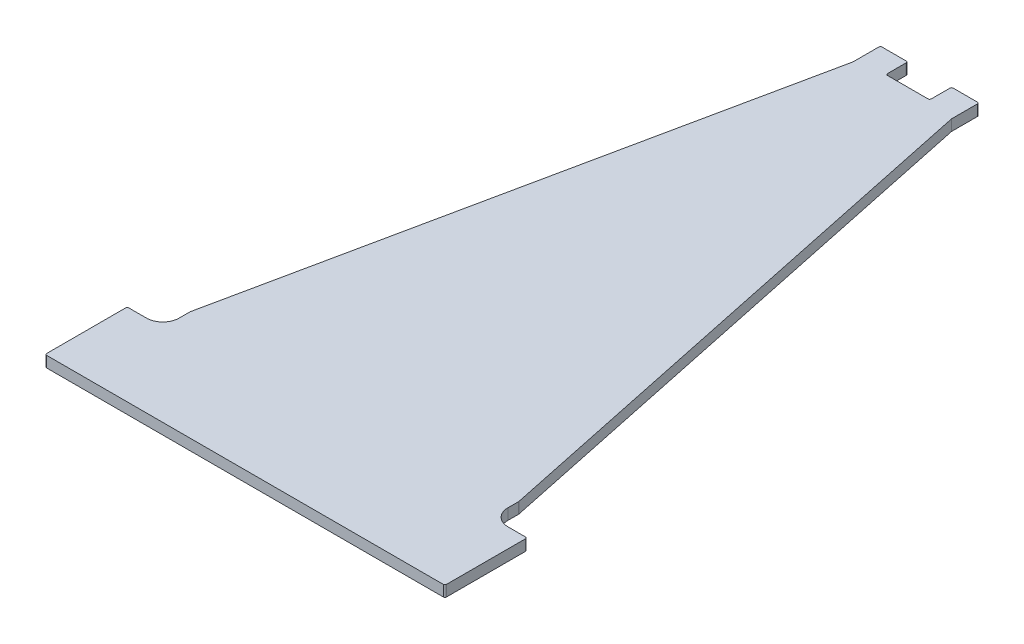
ISO-10303-21;
HEADER;
FILE_DESCRIPTION(('STEP AP214'),'2;1');
FILE_NAME('part.step','',(''),(''),'','','');
FILE_SCHEMA(('AUTOMOTIVE_DESIGN { 1 0 10303 214 1 1 1 1 }'));
ENDSEC;
DATA;
#1=APPLICATION_CONTEXT('core data for automotive mechanical design processes');
#2=APPLICATION_PROTOCOL_DEFINITION('international standard','automotive_design',2000,#1);
#3=PRODUCT_CONTEXT('',#1,'mechanical');
#4=PRODUCT('Part','Part','',(#3));
#5=PRODUCT_RELATED_PRODUCT_CATEGORY('part','',(#4));
#6=PRODUCT_DEFINITION_FORMATION('','',#4);
#7=PRODUCT_DEFINITION_CONTEXT('part definition',#1,'design');
#8=PRODUCT_DEFINITION('design','',#6,#7);
#9=PRODUCT_DEFINITION_SHAPE('','',#8);
#10=(LENGTH_UNIT() NAMED_UNIT(*) SI_UNIT(.MILLI.,.METRE.));
#11=(NAMED_UNIT(*) PLANE_ANGLE_UNIT() SI_UNIT($,.RADIAN.));
#12=(NAMED_UNIT(*) SI_UNIT($,.STERADIAN.) SOLID_ANGLE_UNIT());
#13=UNCERTAINTY_MEASURE_WITH_UNIT(LENGTH_MEASURE(1.E-05),#10,'distance_accuracy_value','');
#14=(GEOMETRIC_REPRESENTATION_CONTEXT(3) GLOBAL_UNCERTAINTY_ASSIGNED_CONTEXT((#13)) GLOBAL_UNIT_ASSIGNED_CONTEXT((#10,
#11,#12)) REPRESENTATION_CONTEXT('',''));
#15=CARTESIAN_POINT('',(0.,0.,0.));
#16=DIRECTION('',(0.,0.,1.));
#17=DIRECTION('',(1.,0.,0.));
#18=AXIS2_PLACEMENT_3D('',#15,#16,#17);
#19=CARTESIAN_POINT('',(7.3,0.2,0.));
#20=DIRECTION('',(0.,0.,-1.));
#21=DIRECTION('',(-1.,0.,0.));
#22=AXIS2_PLACEMENT_3D('',#19,#20,#21);
#23=PLANE('',#22);
#24=DIRECTION('',(1.,0.,0.));
#25=VECTOR('',#24,1.);
#26=CARTESIAN_POINT('',(7.3,0.,0.));
#27=LINE('',#26,#25);
#28=CARTESIAN_POINT('',(0.0299999999999996,0.,0.));
#29=VERTEX_POINT('',#28);
#30=CARTESIAN_POINT('',(7.27,0.,0.));
#31=VERTEX_POINT('',#30);
#32=EDGE_CURVE('E526',#29,#31,#27,.T.);
#33=ORIENTED_EDGE('',*,*,#32,.T.);
#34=DIRECTION('',(0.,-1.,0.));
#35=VECTOR('',#34,1.);
#36=CARTESIAN_POINT('',(7.27,0.2,0.));
#37=LINE('',#36,#35);
#38=CARTESIAN_POINT('',(7.27,0.2,0.));
#39=VERTEX_POINT('',#38);
#40=EDGE_CURVE('E351',#31,#39,#37,.F.);
#41=ORIENTED_EDGE('',*,*,#40,.T.);
#42=DIRECTION('',(1.,0.,0.));
#43=VECTOR('',#42,1.);
#44=CARTESIAN_POINT('',(7.3,0.2,0.));
#45=LINE('',#44,#43);
#46=CARTESIAN_POINT('',(0.0299999999999996,0.2,0.));
#47=VERTEX_POINT('',#46);
#48=EDGE_CURVE('E287',#47,#39,#45,.T.);
#49=ORIENTED_EDGE('',*,*,#48,.F.);
#50=DIRECTION('',(0.,-1.,0.));
#51=VECTOR('',#50,1.);
#52=CARTESIAN_POINT('',(0.0299999999999996,0.2,0.));
#53=LINE('',#52,#51);
#54=EDGE_CURVE('E347',#47,#29,#53,.T.);
#55=ORIENTED_EDGE('',*,*,#54,.T.);
#56=EDGE_LOOP('',(#33,#41,#49,#55));
#57=FACE_BOUND('',#56,.T.);
#58=ADVANCED_FACE('F41',(#57),#23,.F.);
#59=CARTESIAN_POINT('',(7.3,0.2,-1.5));
#60=DIRECTION('',(-1.,0.,0.));
#61=DIRECTION('',(0.,0.,1.));
#62=AXIS2_PLACEMENT_3D('',#59,#60,#61);
#63=PLANE('',#62);
#64=DIRECTION('',(0.,0.,-1.));
#65=VECTOR('',#64,1.);
#66=CARTESIAN_POINT('',(7.3,0.2,-1.5));
#67=LINE('',#66,#65);
#68=CARTESIAN_POINT('',(7.3,0.2,-0.0300000000000001));
#69=VERTEX_POINT('',#68);
#70=CARTESIAN_POINT('',(7.3,0.2,-1.47));
#71=VERTEX_POINT('',#70);
#72=EDGE_CURVE('E587',#69,#71,#67,.T.);
#73=ORIENTED_EDGE('',*,*,#72,.F.);
#74=DIRECTION('',(0.,-1.,0.));
#75=VECTOR('',#74,1.);
#76=CARTESIAN_POINT('',(7.3,0.2,-0.0300000000000001));
#77=LINE('',#76,#75);
#78=CARTESIAN_POINT('',(7.3,0.,-0.0300000000000001));
#79=VERTEX_POINT('',#78);
#80=EDGE_CURVE('E314',#69,#79,#77,.T.);
#81=ORIENTED_EDGE('',*,*,#80,.T.);
#82=DIRECTION('',(0.,0.,-1.));
#83=VECTOR('',#82,1.);
#84=CARTESIAN_POINT('',(7.3,0.,-1.5));
#85=LINE('',#84,#83);
#86=CARTESIAN_POINT('',(7.3,0.,-1.47));
#87=VERTEX_POINT('',#86);
#88=EDGE_CURVE('E530',#79,#87,#85,.T.);
#89=ORIENTED_EDGE('',*,*,#88,.T.);
#90=DIRECTION('',(0.,-1.,0.));
#91=VECTOR('',#90,1.);
#92=CARTESIAN_POINT('',(7.3,0.2,-1.47));
#93=LINE('',#92,#91);
#94=EDGE_CURVE('E311',#87,#71,#93,.F.);
#95=ORIENTED_EDGE('',*,*,#94,.T.);
#96=EDGE_LOOP('',(#73,#81,#89,#95));
#97=FACE_BOUND('',#96,.T.);
#98=ADVANCED_FACE('F712',(#97),#63,.F.);
#99=CARTESIAN_POINT('',(6.65,0.2,-1.5));
#100=DIRECTION('',(0.,0.,1.));
#101=DIRECTION('',(1.,0.,0.));
#102=AXIS2_PLACEMENT_3D('',#99,#100,#101);
#103=PLANE('',#102);
#104=DIRECTION('',(-1.,0.,0.));
#105=VECTOR('',#104,1.);
#106=CARTESIAN_POINT('',(6.65,0.2,-1.5));
#107=LINE('',#106,#105);
#108=CARTESIAN_POINT('',(7.27,0.2,-1.5));
#109=VERTEX_POINT('',#108);
#110=CARTESIAN_POINT('',(6.95,0.2,-1.5));
#111=VERTEX_POINT('',#110);
#112=EDGE_CURVE('E591',#109,#111,#107,.T.);
#113=ORIENTED_EDGE('',*,*,#112,.F.);
#114=DIRECTION('',(0.,-1.,0.));
#115=VECTOR('',#114,1.);
#116=CARTESIAN_POINT('',(7.27,0.2,-1.5));
#117=LINE('',#116,#115);
#118=CARTESIAN_POINT('',(7.27,0.,-1.5));
#119=VERTEX_POINT('',#118);
#120=EDGE_CURVE('E389',#109,#119,#117,.T.);
#121=ORIENTED_EDGE('',*,*,#120,.T.);
#122=DIRECTION('',(-1.,0.,0.));
#123=VECTOR('',#122,1.);
#124=CARTESIAN_POINT('',(6.65,0.,-1.5));
#125=LINE('',#124,#123);
#126=CARTESIAN_POINT('',(6.95,0.,-1.5));
#127=VERTEX_POINT('',#126);
#128=EDGE_CURVE('E534',#119,#127,#125,.T.);
#129=ORIENTED_EDGE('',*,*,#128,.T.);
#130=DIRECTION('',(0.,-1.,0.));
#131=VECTOR('',#130,1.);
#132=CARTESIAN_POINT('',(6.95,0.2,-1.5));
#133=LINE('',#132,#131);
#134=EDGE_CURVE('E265',#127,#111,#133,.F.);
#135=ORIENTED_EDGE('',*,*,#134,.T.);
#136=EDGE_LOOP('',(#113,#121,#129,#135));
#137=FACE_BOUND('',#136,.T.);
#138=ADVANCED_FACE('F704',(#137),#103,.F.);
#139=CARTESIAN_POINT('',(6.65,0.2,-2.));
#140=DIRECTION('',(-1.,0.,0.));
#141=DIRECTION('',(0.,0.,1.));
#142=AXIS2_PLACEMENT_3D('',#139,#140,#141);
#143=PLANE('',#142);
#144=DIRECTION('',(0.,0.,-1.));
#145=VECTOR('',#144,1.);
#146=CARTESIAN_POINT('',(6.65,0.,-2.));
#147=LINE('',#146,#145);
#148=CARTESIAN_POINT('',(6.65,0.,-1.8));
#149=VERTEX_POINT('',#148);
#150=CARTESIAN_POINT('',(6.65,0.,-1.99688398345684));
#151=VERTEX_POINT('',#150);
#152=EDGE_CURVE('E537',#149,#151,#147,.T.);
#153=ORIENTED_EDGE('',*,*,#152,.T.);
#154=DIRECTION('',(0.,-1.,0.));
#155=VECTOR('',#154,1.);
#156=CARTESIAN_POINT('',(6.65,0.2,-1.99688398345684));
#157=LINE('',#156,#155);
#158=CARTESIAN_POINT('',(6.65,0.2,-1.99688398345684));
#159=VERTEX_POINT('',#158);
#160=EDGE_CURVE('E400',#151,#159,#157,.F.);
#161=ORIENTED_EDGE('',*,*,#160,.T.);
#162=DIRECTION('',(0.,0.,-1.));
#163=VECTOR('',#162,1.);
#164=CARTESIAN_POINT('',(6.65,0.2,-2.));
#165=LINE('',#164,#163);
#166=CARTESIAN_POINT('',(6.65,0.2,-1.8));
#167=VERTEX_POINT('',#166);
#168=EDGE_CURVE('E596',#167,#159,#165,.T.);
#169=ORIENTED_EDGE('',*,*,#168,.F.);
#170=DIRECTION('',(0.,-1.,0.));
#171=VECTOR('',#170,1.);
#172=CARTESIAN_POINT('',(6.65,0.,-1.8));
#173=LINE('',#172,#171);
#174=EDGE_CURVE('E295',#167,#149,#173,.T.);
#175=ORIENTED_EDGE('',*,*,#174,.T.);
#176=EDGE_LOOP('',(#153,#161,#169,#175));
#177=FACE_BOUND('',#176,.T.);
#178=ADVANCED_FACE('F694',(#177),#143,.F.);
#179=CARTESIAN_POINT('',(4.55,0.2,-12.));
#180=DIRECTION('',(-0.978653496601971,0.,0.205517234286414));
#181=DIRECTION('',(0.205517234286414,0.,0.978653496601971));
#182=AXIS2_PLACEMENT_3D('',#179,#180,#181);
#183=PLANE('',#182);
#184=DIRECTION('',(-0.205517234286414,0.,-0.978653496601971));
#185=VECTOR('',#184,1.);
#186=CARTESIAN_POINT('',(4.55,0.2,-12.));
#187=LINE('',#186,#185);
#188=CARTESIAN_POINT('',(6.64935960489806,0.2,-2.00304950048543));
#189=VERTEX_POINT('',#188);
#190=CARTESIAN_POINT('',(4.55064039510194,0.2,-11.9969504995146));
#191=VERTEX_POINT('',#190);
#192=EDGE_CURVE('E600',#189,#191,#187,.T.);
#193=ORIENTED_EDGE('',*,*,#192,.F.);
#194=DIRECTION('',(0.,-1.,0.));
#195=VECTOR('',#194,1.);
#196=CARTESIAN_POINT('',(6.64935960489806,0.2,-2.00304950048543));
#197=LINE('',#196,#195);
#198=CARTESIAN_POINT('',(6.64935960489806,0.,-2.00304950048543));
#199=VERTEX_POINT('',#198);
#200=EDGE_CURVE('E396',#189,#199,#197,.T.);
#201=ORIENTED_EDGE('',*,*,#200,.T.);
#202=DIRECTION('',(-0.205517234286414,0.,-0.978653496601971));
#203=VECTOR('',#202,1.);
#204=CARTESIAN_POINT('',(4.55,0.,-12.));
#205=LINE('',#204,#203);
#206=CARTESIAN_POINT('',(4.55064039510194,0.,-11.9969504995146));
#207=VERTEX_POINT('',#206);
#208=EDGE_CURVE('E541',#199,#207,#205,.T.);
#209=ORIENTED_EDGE('',*,*,#208,.T.);
#210=DIRECTION('',(0.,-1.,0.));
#211=VECTOR('',#210,1.);
#212=CARTESIAN_POINT('',(4.55064039510194,0.2,-11.9969504995146));
#213=LINE('',#212,#211);
#214=EDGE_CURVE('E393',#207,#191,#213,.F.);
#215=ORIENTED_EDGE('',*,*,#214,.T.);
#216=EDGE_LOOP('',(#193,#201,#209,#215));
#217=FACE_BOUND('',#216,.T.);
#218=ADVANCED_FACE('F686',(#217),#183,.F.);
#219=CARTESIAN_POINT('',(4.55,0.2,-12.5));
#220=DIRECTION('',(-1.,0.,0.));
#221=DIRECTION('',(0.,0.,1.));
#222=AXIS2_PLACEMENT_3D('',#219,#220,#221);
#223=PLANE('',#222);
#224=DIRECTION('',(0.,0.,-1.));
#225=VECTOR('',#224,1.);
#226=CARTESIAN_POINT('',(4.55,0.2,-12.5));
#227=LINE('',#226,#225);
#228=CARTESIAN_POINT('',(4.55,0.2,-12.0031160165432));
#229=VERTEX_POINT('',#228);
#230=CARTESIAN_POINT('',(4.55,0.2,-12.47));
#231=VERTEX_POINT('',#230);
#232=EDGE_CURVE('E604',#229,#231,#227,.T.);
#233=ORIENTED_EDGE('',*,*,#232,.F.);
#234=DIRECTION('',(0.,-1.,0.));
#235=VECTOR('',#234,1.);
#236=CARTESIAN_POINT('',(4.55,0.,-12.0031160165432));
#237=LINE('',#236,#235);
#238=CARTESIAN_POINT('',(4.55,0.,-12.0031160165432));
#239=VERTEX_POINT('',#238);
#240=EDGE_CURVE('E406',#229,#239,#237,.T.);
#241=ORIENTED_EDGE('',*,*,#240,.T.);
#242=DIRECTION('',(0.,0.,-1.));
#243=VECTOR('',#242,1.);
#244=CARTESIAN_POINT('',(4.55,0.,-12.5));
#245=LINE('',#244,#243);
#246=CARTESIAN_POINT('',(4.55,0.,-12.47));
#247=VERTEX_POINT('',#246);
#248=EDGE_CURVE('E545',#239,#247,#245,.T.);
#249=ORIENTED_EDGE('',*,*,#248,.T.);
#250=DIRECTION('',(0.,-1.,0.));
#251=VECTOR('',#250,1.);
#252=CARTESIAN_POINT('',(4.55,0.2,-12.47));
#253=LINE('',#252,#251);
#254=EDGE_CURVE('E403',#247,#231,#253,.F.);
#255=ORIENTED_EDGE('',*,*,#254,.T.);
#256=EDGE_LOOP('',(#233,#241,#249,#255));
#257=FACE_BOUND('',#256,.T.);
#258=ADVANCED_FACE('F677',(#257),#223,.F.);
#259=CARTESIAN_POINT('',(4.05,0.2,-12.5));
#260=DIRECTION('',(0.,0.,1.));
#261=DIRECTION('',(1.,0.,0.));
#262=AXIS2_PLACEMENT_3D('',#259,#260,#261);
#263=PLANE('',#262);
#264=DIRECTION('',(-1.,0.,0.));
#265=VECTOR('',#264,1.);
#266=CARTESIAN_POINT('',(4.05,0.2,-12.5));
#267=LINE('',#266,#265);
#268=CARTESIAN_POINT('',(4.52,0.2,-12.5));
#269=VERTEX_POINT('',#268);
#270=CARTESIAN_POINT('',(4.08,0.2,-12.5));
#271=VERTEX_POINT('',#270);
#272=EDGE_CURVE('E608',#269,#271,#267,.T.);
#273=ORIENTED_EDGE('',*,*,#272,.F.);
#274=DIRECTION('',(0.,-1.,0.));
#275=VECTOR('',#274,1.);
#276=CARTESIAN_POINT('',(4.52,0.2,-12.5));
#277=LINE('',#276,#275);
#278=CARTESIAN_POINT('',(4.52,0.,-12.5));
#279=VERTEX_POINT('',#278);
#280=EDGE_CURVE('E413',#269,#279,#277,.T.);
#281=ORIENTED_EDGE('',*,*,#280,.T.);
#282=DIRECTION('',(-1.,0.,0.));
#283=VECTOR('',#282,1.);
#284=CARTESIAN_POINT('',(4.05,0.,-12.5));
#285=LINE('',#284,#283);
#286=CARTESIAN_POINT('',(4.08,0.,-12.5));
#287=VERTEX_POINT('',#286);
#288=EDGE_CURVE('E549',#279,#287,#285,.T.);
#289=ORIENTED_EDGE('',*,*,#288,.T.);
#290=DIRECTION('',(0.,-1.,0.));
#291=VECTOR('',#290,1.);
#292=CARTESIAN_POINT('',(4.08,0.2,-12.5));
#293=LINE('',#292,#291);
#294=EDGE_CURVE('E410',#287,#271,#293,.F.);
#295=ORIENTED_EDGE('',*,*,#294,.T.);
#296=EDGE_LOOP('',(#273,#281,#289,#295));
#297=FACE_BOUND('',#296,.T.);
#298=ADVANCED_FACE('F668',(#297),#263,.F.);
#299=CARTESIAN_POINT('',(4.05,0.2,-12.1));
#300=DIRECTION('',(1.,0.,0.));
#301=DIRECTION('',(0.,0.,-1.));
#302=AXIS2_PLACEMENT_3D('',#299,#300,#301);
#303=PLANE('',#302);
#304=DIRECTION('',(0.,0.,1.));
#305=VECTOR('',#304,1.);
#306=CARTESIAN_POINT('',(4.05,0.2,-12.1));
#307=LINE('',#306,#305);
#308=CARTESIAN_POINT('',(4.05,0.2,-12.47));
#309=VERTEX_POINT('',#308);
#310=CARTESIAN_POINT('',(4.05,0.2,-12.13));
#311=VERTEX_POINT('',#310);
#312=EDGE_CURVE('E612',#309,#311,#307,.T.);
#313=ORIENTED_EDGE('',*,*,#312,.F.);
#314=DIRECTION('',(0.,-1.,0.));
#315=VECTOR('',#314,1.);
#316=CARTESIAN_POINT('',(4.05,0.2,-12.47));
#317=LINE('',#316,#315);
#318=CARTESIAN_POINT('',(4.05,0.,-12.47));
#319=VERTEX_POINT('',#318);
#320=EDGE_CURVE('E420',#309,#319,#317,.T.);
#321=ORIENTED_EDGE('',*,*,#320,.T.);
#322=DIRECTION('',(0.,0.,1.));
#323=VECTOR('',#322,1.);
#324=CARTESIAN_POINT('',(4.05,0.,-12.1));
#325=LINE('',#324,#323);
#326=CARTESIAN_POINT('',(4.05,0.,-12.13));
#327=VERTEX_POINT('',#326);
#328=EDGE_CURVE('E553',#319,#327,#325,.T.);
#329=ORIENTED_EDGE('',*,*,#328,.T.);
#330=DIRECTION('',(0.,-1.,0.));
#331=VECTOR('',#330,1.);
#332=CARTESIAN_POINT('',(4.05,0.2,-12.13));
#333=LINE('',#332,#331);
#334=EDGE_CURVE('E417',#327,#311,#333,.F.);
#335=ORIENTED_EDGE('',*,*,#334,.T.);
#336=EDGE_LOOP('',(#313,#321,#329,#335));
#337=FACE_BOUND('',#336,.T.);
#338=ADVANCED_FACE('F659',(#337),#303,.F.);
#339=CARTESIAN_POINT('',(3.25,0.2,-12.1));
#340=DIRECTION('',(0.,0.,1.));
#341=DIRECTION('',(1.,0.,0.));
#342=AXIS2_PLACEMENT_3D('',#339,#340,#341);
#343=PLANE('',#342);
#344=DIRECTION('',(-1.,0.,0.));
#345=VECTOR('',#344,1.);
#346=CARTESIAN_POINT('',(3.25,0.2,-12.1));
#347=LINE('',#346,#345);
#348=CARTESIAN_POINT('',(4.02,0.2,-12.1));
#349=VERTEX_POINT('',#348);
#350=CARTESIAN_POINT('',(3.28,0.2,-12.1));
#351=VERTEX_POINT('',#350);
#352=EDGE_CURVE('E616',#349,#351,#347,.T.);
#353=ORIENTED_EDGE('',*,*,#352,.F.);
#354=DIRECTION('',(0.,-1.,0.));
#355=VECTOR('',#354,1.);
#356=CARTESIAN_POINT('',(4.02,0.,-12.1));
#357=LINE('',#356,#355);
#358=CARTESIAN_POINT('',(4.02,0.,-12.1));
#359=VERTEX_POINT('',#358);
#360=EDGE_CURVE('E427',#349,#359,#357,.T.);
#361=ORIENTED_EDGE('',*,*,#360,.T.);
#362=DIRECTION('',(-1.,0.,0.));
#363=VECTOR('',#362,1.);
#364=CARTESIAN_POINT('',(3.25,0.,-12.1));
#365=LINE('',#364,#363);
#366=CARTESIAN_POINT('',(3.28,0.,-12.1));
#367=VERTEX_POINT('',#366);
#368=EDGE_CURVE('E557',#359,#367,#365,.T.);
#369=ORIENTED_EDGE('',*,*,#368,.T.);
#370=DIRECTION('',(0.,-1.,0.));
#371=VECTOR('',#370,1.);
#372=CARTESIAN_POINT('',(3.28,0.2,-12.1));
#373=LINE('',#372,#371);
#374=EDGE_CURVE('E424',#367,#351,#373,.F.);
#375=ORIENTED_EDGE('',*,*,#374,.T.);
#376=EDGE_LOOP('',(#353,#361,#369,#375));
#377=FACE_BOUND('',#376,.T.);
#378=ADVANCED_FACE('F650',(#377),#343,.F.);
#379=CARTESIAN_POINT('',(3.25,0.2,-12.5));
#380=DIRECTION('',(-1.,0.,0.));
#381=DIRECTION('',(0.,0.,1.));
#382=AXIS2_PLACEMENT_3D('',#379,#380,#381);
#383=PLANE('',#382);
#384=DIRECTION('',(0.,0.,-1.));
#385=VECTOR('',#384,1.);
#386=CARTESIAN_POINT('',(3.25,0.2,-12.5));
#387=LINE('',#386,#385);
#388=CARTESIAN_POINT('',(3.25,0.2,-12.13));
#389=VERTEX_POINT('',#388);
#390=CARTESIAN_POINT('',(3.25,0.2,-12.47));
#391=VERTEX_POINT('',#390);
#392=EDGE_CURVE('E620',#389,#391,#387,.T.);
#393=ORIENTED_EDGE('',*,*,#392,.F.);
#394=DIRECTION('',(0.,-1.,0.));
#395=VECTOR('',#394,1.);
#396=CARTESIAN_POINT('',(3.25,0.,-12.13));
#397=LINE('',#396,#395);
#398=CARTESIAN_POINT('',(3.25,0.,-12.13));
#399=VERTEX_POINT('',#398);
#400=EDGE_CURVE('E434',#389,#399,#397,.T.);
#401=ORIENTED_EDGE('',*,*,#400,.T.);
#402=DIRECTION('',(0.,0.,-1.));
#403=VECTOR('',#402,1.);
#404=CARTESIAN_POINT('',(3.25,0.,-12.5));
#405=LINE('',#404,#403);
#406=CARTESIAN_POINT('',(3.25,0.,-12.47));
#407=VERTEX_POINT('',#406);
#408=EDGE_CURVE('E561',#399,#407,#405,.T.);
#409=ORIENTED_EDGE('',*,*,#408,.T.);
#410=DIRECTION('',(0.,-1.,0.));
#411=VECTOR('',#410,1.);
#412=CARTESIAN_POINT('',(3.25,0.2,-12.47));
#413=LINE('',#412,#411);
#414=EDGE_CURVE('E431',#407,#391,#413,.F.);
#415=ORIENTED_EDGE('',*,*,#414,.T.);
#416=EDGE_LOOP('',(#393,#401,#409,#415));
#417=FACE_BOUND('',#416,.T.);
#418=ADVANCED_FACE('F641',(#417),#383,.F.);
#419=CARTESIAN_POINT('',(2.75,0.2,-12.5));
#420=DIRECTION('',(0.,0.,1.));
#421=DIRECTION('',(1.,0.,0.));
#422=AXIS2_PLACEMENT_3D('',#419,#420,#421);
#423=PLANE('',#422);
#424=DIRECTION('',(-1.,0.,0.));
#425=VECTOR('',#424,1.);
#426=CARTESIAN_POINT('',(2.75,0.2,-12.5));
#427=LINE('',#426,#425);
#428=CARTESIAN_POINT('',(3.22,0.2,-12.5));
#429=VERTEX_POINT('',#428);
#430=CARTESIAN_POINT('',(2.78,0.2,-12.5));
#431=VERTEX_POINT('',#430);
#432=EDGE_CURVE('E518',#429,#431,#427,.T.);
#433=ORIENTED_EDGE('',*,*,#432,.F.);
#434=DIRECTION('',(0.,-1.,0.));
#435=VECTOR('',#434,1.);
#436=CARTESIAN_POINT('',(3.22,0.2,-12.5));
#437=LINE('',#436,#435);
#438=CARTESIAN_POINT('',(3.22,0.,-12.5));
#439=VERTEX_POINT('',#438);
#440=EDGE_CURVE('E441',#429,#439,#437,.T.);
#441=ORIENTED_EDGE('',*,*,#440,.T.);
#442=DIRECTION('',(-1.,0.,0.));
#443=VECTOR('',#442,1.);
#444=CARTESIAN_POINT('',(2.75,0.,-12.5));
#445=LINE('',#444,#443);
#446=CARTESIAN_POINT('',(2.78,0.,-12.5));
#447=VERTEX_POINT('',#446);
#448=EDGE_CURVE('E498',#439,#447,#445,.T.);
#449=ORIENTED_EDGE('',*,*,#448,.T.);
#450=DIRECTION('',(0.,-1.,0.));
#451=VECTOR('',#450,1.);
#452=CARTESIAN_POINT('',(2.78,0.2,-12.5));
#453=LINE('',#452,#451);
#454=EDGE_CURVE('E438',#447,#431,#453,.F.);
#455=ORIENTED_EDGE('',*,*,#454,.T.);
#456=EDGE_LOOP('',(#433,#441,#449,#455));
#457=FACE_BOUND('',#456,.T.);
#458=ADVANCED_FACE('F634',(#457),#423,.F.);
#459=CARTESIAN_POINT('',(2.75,0.2,-12.));
#460=DIRECTION('',(1.,0.,0.));
#461=DIRECTION('',(0.,0.,-1.));
#462=AXIS2_PLACEMENT_3D('',#459,#460,#461);
#463=PLANE('',#462);
#464=DIRECTION('',(0.,0.,1.));
#465=VECTOR('',#464,1.);
#466=CARTESIAN_POINT('',(2.75,0.2,-12.));
#467=LINE('',#466,#465);
#468=CARTESIAN_POINT('',(2.75,0.2,-12.47));
#469=VERTEX_POINT('',#468);
#470=CARTESIAN_POINT('',(2.75,0.2,-12.0031160165432));
#471=VERTEX_POINT('',#470);
#472=EDGE_CURVE('E508',#469,#471,#467,.T.);
#473=ORIENTED_EDGE('',*,*,#472,.F.);
#474=DIRECTION('',(0.,-1.,0.));
#475=VECTOR('',#474,1.);
#476=CARTESIAN_POINT('',(2.75,0.2,-12.47));
#477=LINE('',#476,#475);
#478=CARTESIAN_POINT('',(2.75,0.,-12.47));
#479=VERTEX_POINT('',#478);
#480=EDGE_CURVE('E448',#469,#479,#477,.T.);
#481=ORIENTED_EDGE('',*,*,#480,.T.);
#482=DIRECTION('',(0.,0.,1.));
#483=VECTOR('',#482,1.);
#484=CARTESIAN_POINT('',(2.75,0.,-12.));
#485=LINE('',#484,#483);
#486=CARTESIAN_POINT('',(2.75,0.,-12.0031160165432));
#487=VERTEX_POINT('',#486);
#488=EDGE_CURVE('E487',#479,#487,#485,.T.);
#489=ORIENTED_EDGE('',*,*,#488,.T.);
#490=DIRECTION('',(0.,-1.,0.));
#491=VECTOR('',#490,1.);
#492=CARTESIAN_POINT('',(2.75,0.2,-12.0031160165432));
#493=LINE('',#492,#491);
#494=EDGE_CURVE('E445',#487,#471,#493,.F.);
#495=ORIENTED_EDGE('',*,*,#494,.T.);
#496=EDGE_LOOP('',(#473,#481,#489,#495));
#497=FACE_BOUND('',#496,.T.);
#498=ADVANCED_FACE('F494',(#497),#463,.F.);
#499=CARTESIAN_POINT('',(0.65,0.2,-2.));
#500=DIRECTION('',(0.978653496601971,0.,0.205517234286414));
#501=DIRECTION('',(0.205517234286414,0.,-0.978653496601971));
#502=AXIS2_PLACEMENT_3D('',#499,#500,#501);
#503=PLANE('',#502);
#504=DIRECTION('',(-0.205517234286414,0.,0.978653496601971));
#505=VECTOR('',#504,1.);
#506=CARTESIAN_POINT('',(0.65,0.2,-2.));
#507=LINE('',#506,#505);
#508=CARTESIAN_POINT('',(2.74935960489806,0.2,-11.9969504995146));
#509=VERTEX_POINT('',#508);
#510=CARTESIAN_POINT('',(0.650640395101941,0.2,-2.00304950048543));
#511=VERTEX_POINT('',#510);
#512=EDGE_CURVE('E506',#509,#511,#507,.T.);
#513=ORIENTED_EDGE('',*,*,#512,.F.);
#514=DIRECTION('',(0.,-1.,0.));
#515=VECTOR('',#514,1.);
#516=CARTESIAN_POINT('',(2.74935960489806,0.,-11.9969504995146));
#517=LINE('',#516,#515);
#518=CARTESIAN_POINT('',(2.74935960489806,0.,-11.9969504995146));
#519=VERTEX_POINT('',#518);
#520=EDGE_CURVE('E455',#509,#519,#517,.T.);
#521=ORIENTED_EDGE('',*,*,#520,.T.);
#522=DIRECTION('',(-0.205517234286414,0.,0.978653496601971));
#523=VECTOR('',#522,1.);
#524=CARTESIAN_POINT('',(0.65,0.,-2.));
#525=LINE('',#524,#523);
#526=CARTESIAN_POINT('',(0.650640395101941,0.,-2.00304950048543));
#527=VERTEX_POINT('',#526);
#528=EDGE_CURVE('E289',#519,#527,#525,.T.);
#529=ORIENTED_EDGE('',*,*,#528,.T.);
#530=DIRECTION('',(0.,-1.,0.));
#531=VECTOR('',#530,1.);
#532=CARTESIAN_POINT('',(0.650640395101941,0.2,-2.00304950048543));
#533=LINE('',#532,#531);
#534=EDGE_CURVE('E452',#527,#511,#533,.F.);
#535=ORIENTED_EDGE('',*,*,#534,.T.);
#536=EDGE_LOOP('',(#513,#521,#529,#535));
#537=FACE_BOUND('',#536,.T.);
#538=ADVANCED_FACE('F510',(#537),#503,.F.);
#539=CARTESIAN_POINT('',(0.65,0.2,-1.5));
#540=DIRECTION('',(1.,0.,0.));
#541=DIRECTION('',(0.,0.,-1.));
#542=AXIS2_PLACEMENT_3D('',#539,#540,#541);
#543=PLANE('',#542);
#544=DIRECTION('',(0.,0.,1.));
#545=VECTOR('',#544,1.);
#546=CARTESIAN_POINT('',(0.65,0.2,-1.5));
#547=LINE('',#546,#545);
#548=CARTESIAN_POINT('',(0.65,0.2,-1.99688398345684));
#549=VERTEX_POINT('',#548);
#550=CARTESIAN_POINT('',(0.65,0.2,-1.8));
#551=VERTEX_POINT('',#550);
#552=EDGE_CURVE('E513',#549,#551,#547,.T.);
#553=ORIENTED_EDGE('',*,*,#552,.F.);
#554=DIRECTION('',(0.,-1.,0.));
#555=VECTOR('',#554,1.);
#556=CARTESIAN_POINT('',(0.65,0.2,-1.99688398345684));
#557=LINE('',#556,#555);
#558=CARTESIAN_POINT('',(0.65,0.,-1.99688398345684));
#559=VERTEX_POINT('',#558);
#560=EDGE_CURVE('E459',#549,#559,#557,.T.);
#561=ORIENTED_EDGE('',*,*,#560,.T.);
#562=DIRECTION('',(0.,0.,1.));
#563=VECTOR('',#562,1.);
#564=CARTESIAN_POINT('',(0.65,0.,-1.5));
#565=LINE('',#564,#563);
#566=CARTESIAN_POINT('',(0.65,0.,-1.8));
#567=VERTEX_POINT('',#566);
#568=EDGE_CURVE('E283',#559,#567,#565,.T.);
#569=ORIENTED_EDGE('',*,*,#568,.T.);
#570=DIRECTION('',(0.,-1.,0.));
#571=VECTOR('',#570,1.);
#572=CARTESIAN_POINT('',(0.65,0.2,-1.8));
#573=LINE('',#572,#571);
#574=EDGE_CURVE('E259',#567,#551,#573,.F.);
#575=ORIENTED_EDGE('',*,*,#574,.T.);
#576=EDGE_LOOP('',(#553,#561,#569,#575));
#577=FACE_BOUND('',#576,.T.);
#578=ADVANCED_FACE('F573',(#577),#543,.F.);
#579=CARTESIAN_POINT('',(0.,0.2,-1.5));
#580=DIRECTION('',(0.,0.,1.));
#581=DIRECTION('',(1.,0.,0.));
#582=AXIS2_PLACEMENT_3D('',#579,#580,#581);
#583=PLANE('',#582);
#584=DIRECTION('',(-1.,0.,0.));
#585=VECTOR('',#584,1.);
#586=CARTESIAN_POINT('',(0.,0.,-1.5));
#587=LINE('',#586,#585);
#588=CARTESIAN_POINT('',(0.35,0.,-1.5));
#589=VERTEX_POINT('',#588);
#590=CARTESIAN_POINT('',(0.03,0.,-1.5));
#591=VERTEX_POINT('',#590);
#592=EDGE_CURVE('E271',#589,#591,#587,.T.);
#593=ORIENTED_EDGE('',*,*,#592,.T.);
#594=DIRECTION('',(0.,-1.,0.));
#595=VECTOR('',#594,1.);
#596=CARTESIAN_POINT('',(0.03,0.2,-1.5));
#597=LINE('',#596,#595);
#598=CARTESIAN_POINT('',(0.03,0.2,-1.5));
#599=VERTEX_POINT('',#598);
#600=EDGE_CURVE('E463',#591,#599,#597,.F.);
#601=ORIENTED_EDGE('',*,*,#600,.T.);
#602=DIRECTION('',(-1.,0.,0.));
#603=VECTOR('',#602,1.);
#604=CARTESIAN_POINT('',(0.,0.2,-1.5));
#605=LINE('',#604,#603);
#606=CARTESIAN_POINT('',(0.35,0.2,-1.5));
#607=VERTEX_POINT('',#606);
#608=EDGE_CURVE('E273',#607,#599,#605,.T.);
#609=ORIENTED_EDGE('',*,*,#608,.F.);
#610=DIRECTION('',(0.,-1.,0.));
#611=VECTOR('',#610,1.);
#612=CARTESIAN_POINT('',(0.35,0.,-1.5));
#613=LINE('',#612,#611);
#614=EDGE_CURVE('E257',#607,#589,#613,.T.);
#615=ORIENTED_EDGE('',*,*,#614,.T.);
#616=EDGE_LOOP('',(#593,#601,#609,#615));
#617=FACE_BOUND('',#616,.T.);
#618=ADVANCED_FACE('F270',(#617),#583,.F.);
#619=CARTESIAN_POINT('',(0.,0.2,0.));
#620=DIRECTION('',(1.,0.,0.));
#621=DIRECTION('',(0.,0.,-1.));
#622=AXIS2_PLACEMENT_3D('',#619,#620,#621);
#623=PLANE('',#622);
#624=DIRECTION('',(0.,0.,1.));
#625=VECTOR('',#624,1.);
#626=CARTESIAN_POINT('',(0.,0.,0.));
#627=LINE('',#626,#625);
#628=CARTESIAN_POINT('',(0.,0.,-1.47));
#629=VERTEX_POINT('',#628);
#630=CARTESIAN_POINT('',(0.,0.,-0.03));
#631=VERTEX_POINT('',#630);
#632=EDGE_CURVE('E282',#629,#631,#627,.T.);
#633=ORIENTED_EDGE('',*,*,#632,.T.);
#634=DIRECTION('',(0.,-1.,0.));
#635=VECTOR('',#634,1.);
#636=CARTESIAN_POINT('',(0.,0.2,-0.03));
#637=LINE('',#636,#635);
#638=CARTESIAN_POINT('',(0.,0.2,-0.03));
#639=VERTEX_POINT('',#638);
#640=EDGE_CURVE('E57',#631,#639,#637,.F.);
#641=ORIENTED_EDGE('',*,*,#640,.T.);
#642=DIRECTION('',(0.,0.,1.));
#643=VECTOR('',#642,1.);
#644=CARTESIAN_POINT('',(0.,0.2,0.));
#645=LINE('',#644,#643);
#646=CARTESIAN_POINT('',(0.,0.2,-1.47));
#647=VERTEX_POINT('',#646);
#648=EDGE_CURVE('E275',#647,#639,#645,.T.);
#649=ORIENTED_EDGE('',*,*,#648,.F.);
#650=DIRECTION('',(0.,-1.,0.));
#651=VECTOR('',#650,1.);
#652=CARTESIAN_POINT('',(0.,0.2,-1.47));
#653=LINE('',#652,#651);
#654=EDGE_CURVE('E383',#647,#629,#653,.T.);
#655=ORIENTED_EDGE('',*,*,#654,.T.);
#656=EDGE_LOOP('',(#633,#641,#649,#655));
#657=FACE_BOUND('',#656,.T.);
#658=ADVANCED_FACE('F576',(#657),#623,.F.);
#659=CARTESIAN_POINT('',(0.,0.2,0.));
#660=DIRECTION('',(0.,-1.,0.));
#661=DIRECTION('',(0.,0.,-1.));
#662=AXIS2_PLACEMENT_3D('',#659,#660,#661);
#663=PLANE('',#662);
#664=ORIENTED_EDGE('',*,*,#48,.T.);
#665=CARTESIAN_POINT('',(7.27,0.2,-0.0300000000000001));
#666=DIRECTION('',(0.,-1.,0.));
#667=DIRECTION('',(0.,0.,-1.));
#668=AXIS2_PLACEMENT_3D('',#665,#666,#667);
#669=CIRCLE('',#668,0.03);
#670=EDGE_CURVE('E380',#39,#69,#669,.F.);
#671=ORIENTED_EDGE('',*,*,#670,.T.);
#672=ORIENTED_EDGE('',*,*,#72,.T.);
#673=CARTESIAN_POINT('',(7.27,0.2,-1.47));
#674=DIRECTION('',(0.,-1.,0.));
#675=DIRECTION('',(0.,0.,-1.));
#676=AXIS2_PLACEMENT_3D('',#673,#674,#675);
#677=CIRCLE('',#676,0.03);
#678=EDGE_CURVE('E374',#71,#109,#677,.F.);
#679=ORIENTED_EDGE('',*,*,#678,.T.);
#680=ORIENTED_EDGE('',*,*,#112,.T.);
#681=CARTESIAN_POINT('',(6.95,0.2,-1.8));
#682=DIRECTION('',(0.,-1.,0.));
#683=DIRECTION('',(0.,0.,-1.));
#684=AXIS2_PLACEMENT_3D('',#681,#682,#683);
#685=CIRCLE('',#684,0.3);
#686=EDGE_CURVE('E308',#111,#167,#685,.T.);
#687=ORIENTED_EDGE('',*,*,#686,.T.);
#688=ORIENTED_EDGE('',*,*,#168,.T.);
#689=CARTESIAN_POINT('',(6.62,0.2,-1.99688398345684));
#690=DIRECTION('',(0.,-1.,0.));
#691=DIRECTION('',(0.,0.,-1.));
#692=AXIS2_PLACEMENT_3D('',#689,#690,#691);
#693=CIRCLE('',#692,0.03);
#694=EDGE_CURVE('E371',#159,#189,#693,.F.);
#695=ORIENTED_EDGE('',*,*,#694,.T.);
#696=ORIENTED_EDGE('',*,*,#192,.T.);
#697=CARTESIAN_POINT('',(4.58,0.2,-12.0031160165432));
#698=DIRECTION('',(0.,-1.,0.));
#699=DIRECTION('',(0.,0.,-1.));
#700=AXIS2_PLACEMENT_3D('',#697,#698,#699);
#701=CIRCLE('',#700,0.03);
#702=EDGE_CURVE('E469',#191,#229,#701,.T.);
#703=ORIENTED_EDGE('',*,*,#702,.T.);
#704=ORIENTED_EDGE('',*,*,#232,.T.);
#705=CARTESIAN_POINT('',(4.52,0.2,-12.47));
#706=DIRECTION('',(0.,-1.,0.));
#707=DIRECTION('',(0.,0.,-1.));
#708=AXIS2_PLACEMENT_3D('',#705,#706,#707);
#709=CIRCLE('',#708,0.03);
#710=EDGE_CURVE('E368',#231,#269,#709,.F.);
#711=ORIENTED_EDGE('',*,*,#710,.T.);
#712=ORIENTED_EDGE('',*,*,#272,.T.);
#713=CARTESIAN_POINT('',(4.08,0.2,-12.47));
#714=DIRECTION('',(0.,-1.,0.));
#715=DIRECTION('',(0.,0.,-1.));
#716=AXIS2_PLACEMENT_3D('',#713,#714,#715);
#717=CIRCLE('',#716,0.03);
#718=EDGE_CURVE('E365',#271,#309,#717,.F.);
#719=ORIENTED_EDGE('',*,*,#718,.T.);
#720=ORIENTED_EDGE('',*,*,#312,.T.);
#721=CARTESIAN_POINT('',(4.02,0.2,-12.13));
#722=DIRECTION('',(0.,-1.,0.));
#723=DIRECTION('',(0.,0.,-1.));
#724=AXIS2_PLACEMENT_3D('',#721,#722,#723);
#725=CIRCLE('',#724,0.03);
#726=EDGE_CURVE('E475',#311,#349,#725,.T.);
#727=ORIENTED_EDGE('',*,*,#726,.T.);
#728=ORIENTED_EDGE('',*,*,#352,.T.);
#729=CARTESIAN_POINT('',(3.28,0.2,-12.13));
#730=DIRECTION('',(0.,-1.,0.));
#731=DIRECTION('',(0.,0.,-1.));
#732=AXIS2_PLACEMENT_3D('',#729,#730,#731);
#733=CIRCLE('',#732,0.03);
#734=EDGE_CURVE('E481',#351,#389,#733,.T.);
#735=ORIENTED_EDGE('',*,*,#734,.T.);
#736=ORIENTED_EDGE('',*,*,#392,.T.);
#737=CARTESIAN_POINT('',(3.22,0.2,-12.47));
#738=DIRECTION('',(0.,-1.,0.));
#739=DIRECTION('',(0.,0.,-1.));
#740=AXIS2_PLACEMENT_3D('',#737,#738,#739);
#741=CIRCLE('',#740,0.03);
#742=EDGE_CURVE('E362',#391,#429,#741,.F.);
#743=ORIENTED_EDGE('',*,*,#742,.T.);
#744=ORIENTED_EDGE('',*,*,#432,.T.);
#745=CARTESIAN_POINT('',(2.78,0.2,-12.47));
#746=DIRECTION('',(0.,-1.,0.));
#747=DIRECTION('',(0.,0.,-1.));
#748=AXIS2_PLACEMENT_3D('',#745,#746,#747);
#749=CIRCLE('',#748,0.03);
#750=EDGE_CURVE('E359',#431,#469,#749,.F.);
#751=ORIENTED_EDGE('',*,*,#750,.T.);
#752=ORIENTED_EDGE('',*,*,#472,.T.);
#753=CARTESIAN_POINT('',(2.72,0.2,-12.0031160165432));
#754=DIRECTION('',(0.,-1.,0.));
#755=DIRECTION('',(0.,0.,-1.));
#756=AXIS2_PLACEMENT_3D('',#753,#754,#755);
#757=CIRCLE('',#756,0.03);
#758=EDGE_CURVE('E11',#471,#509,#757,.T.);
#759=ORIENTED_EDGE('',*,*,#758,.T.);
#760=ORIENTED_EDGE('',*,*,#512,.T.);
#761=CARTESIAN_POINT('',(0.68,0.2,-1.99688398345684));
#762=DIRECTION('',(0.,-1.,0.));
#763=DIRECTION('',(0.,0.,-1.));
#764=AXIS2_PLACEMENT_3D('',#761,#762,#763);
#765=CIRCLE('',#764,0.03);
#766=EDGE_CURVE('E356',#511,#549,#765,.F.);
#767=ORIENTED_EDGE('',*,*,#766,.T.);
#768=ORIENTED_EDGE('',*,*,#552,.T.);
#769=CARTESIAN_POINT('',(0.35,0.2,-1.8));
#770=DIRECTION('',(0.,-1.,0.));
#771=DIRECTION('',(0.,0.,-1.));
#772=AXIS2_PLACEMENT_3D('',#769,#770,#771);
#773=CIRCLE('',#772,0.3);
#774=EDGE_CURVE('E264',#551,#607,#773,.T.);
#775=ORIENTED_EDGE('',*,*,#774,.T.);
#776=ORIENTED_EDGE('',*,*,#608,.T.);
#777=CARTESIAN_POINT('',(0.03,0.2,-1.47));
#778=DIRECTION('',(0.,-1.,0.));
#779=DIRECTION('',(0.,0.,-1.));
#780=AXIS2_PLACEMENT_3D('',#777,#778,#779);
#781=CIRCLE('',#780,0.03);
#782=EDGE_CURVE('E64',#599,#647,#781,.F.);
#783=ORIENTED_EDGE('',*,*,#782,.T.);
#784=ORIENTED_EDGE('',*,*,#648,.T.);
#785=CARTESIAN_POINT('',(0.0299999999999996,0.2,-0.03));
#786=DIRECTION('',(0.,-1.,0.));
#787=DIRECTION('',(0.,0.,-1.));
#788=AXIS2_PLACEMENT_3D('',#785,#786,#787);
#789=CIRCLE('',#788,0.03);
#790=EDGE_CURVE('E377',#639,#47,#789,.F.);
#791=ORIENTED_EDGE('',*,*,#790,.T.);
#792=EDGE_LOOP('',(#664,#671,#672,#679,#680,#687,#688,#695,#696,#703,#704,#711,#712,#719,#720,
#727,#728,#735,#736,#743,#744,#751,#752,#759,#760,#767,#768,#775,#776,#783,#784,#791));
#793=FACE_BOUND('',#792,.T.);
#794=ADVANCED_FACE('F505',(#793),#663,.F.);
#795=CARTESIAN_POINT('',(0.,0.,0.));
#796=DIRECTION('',(0.,-1.,0.));
#797=DIRECTION('',(0.,0.,-1.));
#798=AXIS2_PLACEMENT_3D('',#795,#796,#797);
#799=PLANE('',#798);
#800=ORIENTED_EDGE('',*,*,#88,.F.);
#801=CARTESIAN_POINT('',(7.27,0.,-0.0300000000000001));
#802=DIRECTION('',(0.,-1.,0.));
#803=DIRECTION('',(0.,0.,-1.));
#804=AXIS2_PLACEMENT_3D('',#801,#802,#803);
#805=CIRCLE('',#804,0.03);
#806=EDGE_CURVE('E344',#79,#31,#805,.T.);
#807=ORIENTED_EDGE('',*,*,#806,.T.);
#808=ORIENTED_EDGE('',*,*,#32,.F.);
#809=CARTESIAN_POINT('',(0.0299999999999996,0.,-0.03));
#810=DIRECTION('',(0.,-1.,0.));
#811=DIRECTION('',(0.,0.,-1.));
#812=AXIS2_PLACEMENT_3D('',#809,#810,#811);
#813=CIRCLE('',#812,0.03);
#814=EDGE_CURVE('E341',#29,#631,#813,.T.);
#815=ORIENTED_EDGE('',*,*,#814,.T.);
#816=ORIENTED_EDGE('',*,*,#632,.F.);
#817=CARTESIAN_POINT('',(0.03,0.,-1.47));
#818=DIRECTION('',(0.,-1.,0.));
#819=DIRECTION('',(0.,0.,-1.));
#820=AXIS2_PLACEMENT_3D('',#817,#818,#819);
#821=CIRCLE('',#820,0.03);
#822=EDGE_CURVE('E280',#629,#591,#821,.T.);
#823=ORIENTED_EDGE('',*,*,#822,.T.);
#824=ORIENTED_EDGE('',*,*,#592,.F.);
#825=CARTESIAN_POINT('',(0.35,0.,-1.8));
#826=DIRECTION('',(0.,-1.,0.));
#827=DIRECTION('',(0.,0.,-1.));
#828=AXIS2_PLACEMENT_3D('',#825,#826,#827);
#829=CIRCLE('',#828,0.3);
#830=EDGE_CURVE('E253',#589,#567,#829,.F.);
#831=ORIENTED_EDGE('',*,*,#830,.T.);
#832=ORIENTED_EDGE('',*,*,#568,.F.);
#833=CARTESIAN_POINT('',(0.68,0.,-1.99688398345684));
#834=DIRECTION('',(0.,-1.,0.));
#835=DIRECTION('',(0.,0.,-1.));
#836=AXIS2_PLACEMENT_3D('',#833,#834,#835);
#837=CIRCLE('',#836,0.03);
#838=EDGE_CURVE('E320',#559,#527,#837,.T.);
#839=ORIENTED_EDGE('',*,*,#838,.T.);
#840=ORIENTED_EDGE('',*,*,#528,.F.);
#841=CARTESIAN_POINT('',(2.72,0.,-12.0031160165432));
#842=DIRECTION('',(0.,-1.,0.));
#843=DIRECTION('',(0.,0.,-1.));
#844=AXIS2_PLACEMENT_3D('',#841,#842,#843);
#845=CIRCLE('',#844,0.03);
#846=EDGE_CURVE('E50',#519,#487,#845,.F.);
#847=ORIENTED_EDGE('',*,*,#846,.T.);
#848=ORIENTED_EDGE('',*,*,#488,.F.);
#849=CARTESIAN_POINT('',(2.78,0.,-12.47));
#850=DIRECTION('',(0.,-1.,0.));
#851=DIRECTION('',(0.,0.,-1.));
#852=AXIS2_PLACEMENT_3D('',#849,#850,#851);
#853=CIRCLE('',#852,0.03);
#854=EDGE_CURVE('E323',#479,#447,#853,.T.);
#855=ORIENTED_EDGE('',*,*,#854,.T.);
#856=ORIENTED_EDGE('',*,*,#448,.F.);
#857=CARTESIAN_POINT('',(3.22,0.,-12.47));
#858=DIRECTION('',(0.,-1.,0.));
#859=DIRECTION('',(0.,0.,-1.));
#860=AXIS2_PLACEMENT_3D('',#857,#858,#859);
#861=CIRCLE('',#860,0.03);
#862=EDGE_CURVE('E326',#439,#407,#861,.T.);
#863=ORIENTED_EDGE('',*,*,#862,.T.);
#864=ORIENTED_EDGE('',*,*,#408,.F.);
#865=CARTESIAN_POINT('',(3.28,0.,-12.13));
#866=DIRECTION('',(0.,-1.,0.));
#867=DIRECTION('',(0.,0.,-1.));
#868=AXIS2_PLACEMENT_3D('',#865,#866,#867);
#869=CIRCLE('',#868,0.03);
#870=EDGE_CURVE('E478',#399,#367,#869,.F.);
#871=ORIENTED_EDGE('',*,*,#870,.T.);
#872=ORIENTED_EDGE('',*,*,#368,.F.);
#873=CARTESIAN_POINT('',(4.02,0.,-12.13));
#874=DIRECTION('',(0.,-1.,0.));
#875=DIRECTION('',(0.,0.,-1.));
#876=AXIS2_PLACEMENT_3D('',#873,#874,#875);
#877=CIRCLE('',#876,0.03);
#878=EDGE_CURVE('E472',#359,#327,#877,.F.);
#879=ORIENTED_EDGE('',*,*,#878,.T.);
#880=ORIENTED_EDGE('',*,*,#328,.F.);
#881=CARTESIAN_POINT('',(4.08,0.,-12.47));
#882=DIRECTION('',(0.,-1.,0.));
#883=DIRECTION('',(0.,0.,-1.));
#884=AXIS2_PLACEMENT_3D('',#881,#882,#883);
#885=CIRCLE('',#884,0.03);
#886=EDGE_CURVE('E329',#319,#287,#885,.T.);
#887=ORIENTED_EDGE('',*,*,#886,.T.);
#888=ORIENTED_EDGE('',*,*,#288,.F.);
#889=CARTESIAN_POINT('',(4.52,0.,-12.47));
#890=DIRECTION('',(0.,-1.,0.));
#891=DIRECTION('',(0.,0.,-1.));
#892=AXIS2_PLACEMENT_3D('',#889,#890,#891);
#893=CIRCLE('',#892,0.03);
#894=EDGE_CURVE('E332',#279,#247,#893,.T.);
#895=ORIENTED_EDGE('',*,*,#894,.T.);
#896=ORIENTED_EDGE('',*,*,#248,.F.);
#897=CARTESIAN_POINT('',(4.58,0.,-12.0031160165432));
#898=DIRECTION('',(0.,-1.,0.));
#899=DIRECTION('',(0.,0.,-1.));
#900=AXIS2_PLACEMENT_3D('',#897,#898,#899);
#901=CIRCLE('',#900,0.03);
#902=EDGE_CURVE('E466',#239,#207,#901,.F.);
#903=ORIENTED_EDGE('',*,*,#902,.T.);
#904=ORIENTED_EDGE('',*,*,#208,.F.);
#905=CARTESIAN_POINT('',(6.62,0.,-1.99688398345684));
#906=DIRECTION('',(0.,-1.,0.));
#907=DIRECTION('',(0.,0.,-1.));
#908=AXIS2_PLACEMENT_3D('',#905,#906,#907);
#909=CIRCLE('',#908,0.03);
#910=EDGE_CURVE('E335',#199,#151,#909,.T.);
#911=ORIENTED_EDGE('',*,*,#910,.T.);
#912=ORIENTED_EDGE('',*,*,#152,.F.);
#913=CARTESIAN_POINT('',(6.95,0.,-1.8));
#914=DIRECTION('',(0.,-1.,0.));
#915=DIRECTION('',(0.,0.,-1.));
#916=AXIS2_PLACEMENT_3D('',#913,#914,#915);
#917=CIRCLE('',#916,0.3);
#918=EDGE_CURVE('E304',#149,#127,#917,.F.);
#919=ORIENTED_EDGE('',*,*,#918,.T.);
#920=ORIENTED_EDGE('',*,*,#128,.F.);
#921=CARTESIAN_POINT('',(7.27,0.,-1.47));
#922=DIRECTION('',(0.,-1.,0.));
#923=DIRECTION('',(0.,0.,-1.));
#924=AXIS2_PLACEMENT_3D('',#921,#922,#923);
#925=CIRCLE('',#924,0.03);
#926=EDGE_CURVE('E338',#119,#87,#925,.T.);
#927=ORIENTED_EDGE('',*,*,#926,.T.);
#928=EDGE_LOOP('',(#800,#807,#808,#815,#816,#823,#824,#831,#832,#839,#840,#847,#848,#855,#856,
#863,#864,#871,#872,#879,#880,#887,#888,#895,#896,#903,#904,#911,#912,#919,#920,#927));
#929=FACE_BOUND('',#928,.T.);
#930=ADVANCED_FACE('F278',(#929),#799,.T.);
#931=CARTESIAN_POINT('',(0.35,0.2,-1.8));
#932=DIRECTION('',(0.,1.,0.));
#933=DIRECTION('',(0.,0.,1.));
#934=AXIS2_PLACEMENT_3D('',#931,#932,#933);
#935=CYLINDRICAL_SURFACE('',#934,0.3);
#936=ORIENTED_EDGE('',*,*,#774,.F.);
#937=ORIENTED_EDGE('',*,*,#574,.F.);
#938=ORIENTED_EDGE('',*,*,#830,.F.);
#939=ORIENTED_EDGE('',*,*,#614,.F.);
#940=EDGE_LOOP('',(#936,#937,#938,#939));
#941=FACE_BOUND('',#940,.T.);
#942=ADVANCED_FACE('F256',(#941),#935,.F.);
#943=CARTESIAN_POINT('',(6.95,0.2,-1.8));
#944=DIRECTION('',(0.,1.,0.));
#945=DIRECTION('',(0.,0.,1.));
#946=AXIS2_PLACEMENT_3D('',#943,#944,#945);
#947=CYLINDRICAL_SURFACE('',#946,0.3);
#948=ORIENTED_EDGE('',*,*,#686,.F.);
#949=ORIENTED_EDGE('',*,*,#134,.F.);
#950=ORIENTED_EDGE('',*,*,#918,.F.);
#951=ORIENTED_EDGE('',*,*,#174,.F.);
#952=EDGE_LOOP('',(#948,#949,#950,#951));
#953=FACE_BOUND('',#952,.T.);
#954=ADVANCED_FACE('F699',(#953),#947,.F.);
#955=CARTESIAN_POINT('',(7.27,0.2,-0.0300000000000001));
#956=DIRECTION('',(0.,-1.,0.));
#957=DIRECTION('',(0.,0.,-1.));
#958=AXIS2_PLACEMENT_3D('',#955,#956,#957);
#959=CYLINDRICAL_SURFACE('',#958,0.03);
#960=ORIENTED_EDGE('',*,*,#670,.F.);
#961=ORIENTED_EDGE('',*,*,#40,.F.);
#962=ORIENTED_EDGE('',*,*,#806,.F.);
#963=ORIENTED_EDGE('',*,*,#80,.F.);
#964=EDGE_LOOP('',(#960,#961,#962,#963));
#965=FACE_BOUND('',#964,.T.);
#966=ADVANCED_FACE('F715',(#965),#959,.T.);
#967=CARTESIAN_POINT('',(0.0299999999999996,0.2,-0.03));
#968=DIRECTION('',(0.,-1.,0.));
#969=DIRECTION('',(0.,0.,-1.));
#970=AXIS2_PLACEMENT_3D('',#967,#968,#969);
#971=CYLINDRICAL_SURFACE('',#970,0.03);
#972=ORIENTED_EDGE('',*,*,#790,.F.);
#973=ORIENTED_EDGE('',*,*,#640,.F.);
#974=ORIENTED_EDGE('',*,*,#814,.F.);
#975=ORIENTED_EDGE('',*,*,#54,.F.);
#976=EDGE_LOOP('',(#972,#973,#974,#975));
#977=FACE_BOUND('',#976,.T.);
#978=ADVANCED_FACE('F581',(#977),#971,.T.);
#979=CARTESIAN_POINT('',(7.27,0.2,-1.47));
#980=DIRECTION('',(0.,-1.,0.));
#981=DIRECTION('',(0.,0.,-1.));
#982=AXIS2_PLACEMENT_3D('',#979,#980,#981);
#983=CYLINDRICAL_SURFACE('',#982,0.03);
#984=ORIENTED_EDGE('',*,*,#678,.F.);
#985=ORIENTED_EDGE('',*,*,#94,.F.);
#986=ORIENTED_EDGE('',*,*,#926,.F.);
#987=ORIENTED_EDGE('',*,*,#120,.F.);
#988=EDGE_LOOP('',(#984,#985,#986,#987));
#989=FACE_BOUND('',#988,.T.);
#990=ADVANCED_FACE('F708',(#989),#983,.T.);
#991=CARTESIAN_POINT('',(6.62,0.2,-1.99688398345684));
#992=DIRECTION('',(0.,-1.,0.));
#993=DIRECTION('',(0.,0.,-1.));
#994=AXIS2_PLACEMENT_3D('',#991,#992,#993);
#995=CYLINDRICAL_SURFACE('',#994,0.03);
#996=ORIENTED_EDGE('',*,*,#694,.F.);
#997=ORIENTED_EDGE('',*,*,#160,.F.);
#998=ORIENTED_EDGE('',*,*,#910,.F.);
#999=ORIENTED_EDGE('',*,*,#200,.F.);
#1000=EDGE_LOOP('',(#996,#997,#998,#999));
#1001=FACE_BOUND('',#1000,.T.);
#1002=ADVANCED_FACE('F690',(#1001),#995,.T.);
#1003=CARTESIAN_POINT('',(4.58,0.2,-12.0031160165432));
#1004=DIRECTION('',(0.,1.,0.));
#1005=DIRECTION('',(0.,0.,1.));
#1006=AXIS2_PLACEMENT_3D('',#1003,#1004,#1005);
#1007=CYLINDRICAL_SURFACE('',#1006,0.03);
#1008=ORIENTED_EDGE('',*,*,#702,.F.);
#1009=ORIENTED_EDGE('',*,*,#214,.F.);
#1010=ORIENTED_EDGE('',*,*,#902,.F.);
#1011=ORIENTED_EDGE('',*,*,#240,.F.);
#1012=EDGE_LOOP('',(#1008,#1009,#1010,#1011));
#1013=FACE_BOUND('',#1012,.T.);
#1014=ADVANCED_FACE('F681',(#1013),#1007,.F.);
#1015=CARTESIAN_POINT('',(4.52,0.2,-12.47));
#1016=DIRECTION('',(0.,-1.,0.));
#1017=DIRECTION('',(0.,0.,-1.));
#1018=AXIS2_PLACEMENT_3D('',#1015,#1016,#1017);
#1019=CYLINDRICAL_SURFACE('',#1018,0.03);
#1020=ORIENTED_EDGE('',*,*,#710,.F.);
#1021=ORIENTED_EDGE('',*,*,#254,.F.);
#1022=ORIENTED_EDGE('',*,*,#894,.F.);
#1023=ORIENTED_EDGE('',*,*,#280,.F.);
#1024=EDGE_LOOP('',(#1020,#1021,#1022,#1023));
#1025=FACE_BOUND('',#1024,.T.);
#1026=ADVANCED_FACE('F672',(#1025),#1019,.T.);
#1027=CARTESIAN_POINT('',(4.08,0.2,-12.47));
#1028=DIRECTION('',(0.,-1.,0.));
#1029=DIRECTION('',(0.,0.,-1.));
#1030=AXIS2_PLACEMENT_3D('',#1027,#1028,#1029);
#1031=CYLINDRICAL_SURFACE('',#1030,0.03);
#1032=ORIENTED_EDGE('',*,*,#718,.F.);
#1033=ORIENTED_EDGE('',*,*,#294,.F.);
#1034=ORIENTED_EDGE('',*,*,#886,.F.);
#1035=ORIENTED_EDGE('',*,*,#320,.F.);
#1036=EDGE_LOOP('',(#1032,#1033,#1034,#1035));
#1037=FACE_BOUND('',#1036,.T.);
#1038=ADVANCED_FACE('F663',(#1037),#1031,.T.);
#1039=CARTESIAN_POINT('',(4.02,0.2,-12.13));
#1040=DIRECTION('',(0.,1.,0.));
#1041=DIRECTION('',(0.,0.,1.));
#1042=AXIS2_PLACEMENT_3D('',#1039,#1040,#1041);
#1043=CYLINDRICAL_SURFACE('',#1042,0.03);
#1044=ORIENTED_EDGE('',*,*,#726,.F.);
#1045=ORIENTED_EDGE('',*,*,#334,.F.);
#1046=ORIENTED_EDGE('',*,*,#878,.F.);
#1047=ORIENTED_EDGE('',*,*,#360,.F.);
#1048=EDGE_LOOP('',(#1044,#1045,#1046,#1047));
#1049=FACE_BOUND('',#1048,.T.);
#1050=ADVANCED_FACE('F654',(#1049),#1043,.F.);
#1051=CARTESIAN_POINT('',(3.28,0.2,-12.13));
#1052=DIRECTION('',(0.,1.,0.));
#1053=DIRECTION('',(0.,0.,1.));
#1054=AXIS2_PLACEMENT_3D('',#1051,#1052,#1053);
#1055=CYLINDRICAL_SURFACE('',#1054,0.03);
#1056=ORIENTED_EDGE('',*,*,#734,.F.);
#1057=ORIENTED_EDGE('',*,*,#374,.F.);
#1058=ORIENTED_EDGE('',*,*,#870,.F.);
#1059=ORIENTED_EDGE('',*,*,#400,.F.);
#1060=EDGE_LOOP('',(#1056,#1057,#1058,#1059));
#1061=FACE_BOUND('',#1060,.T.);
#1062=ADVANCED_FACE('F645',(#1061),#1055,.F.);
#1063=CARTESIAN_POINT('',(3.22,0.2,-12.47));
#1064=DIRECTION('',(0.,-1.,0.));
#1065=DIRECTION('',(0.,0.,-1.));
#1066=AXIS2_PLACEMENT_3D('',#1063,#1064,#1065);
#1067=CYLINDRICAL_SURFACE('',#1066,0.03);
#1068=ORIENTED_EDGE('',*,*,#742,.F.);
#1069=ORIENTED_EDGE('',*,*,#414,.F.);
#1070=ORIENTED_EDGE('',*,*,#862,.F.);
#1071=ORIENTED_EDGE('',*,*,#440,.F.);
#1072=EDGE_LOOP('',(#1068,#1069,#1070,#1071));
#1073=FACE_BOUND('',#1072,.T.);
#1074=ADVANCED_FACE('F636',(#1073),#1067,.T.);
#1075=CARTESIAN_POINT('',(2.78,0.2,-12.47));
#1076=DIRECTION('',(0.,-1.,0.));
#1077=DIRECTION('',(0.,0.,-1.));
#1078=AXIS2_PLACEMENT_3D('',#1075,#1076,#1077);
#1079=CYLINDRICAL_SURFACE('',#1078,0.03);
#1080=ORIENTED_EDGE('',*,*,#750,.F.);
#1081=ORIENTED_EDGE('',*,*,#454,.F.);
#1082=ORIENTED_EDGE('',*,*,#854,.F.);
#1083=ORIENTED_EDGE('',*,*,#480,.F.);
#1084=EDGE_LOOP('',(#1080,#1081,#1082,#1083));
#1085=FACE_BOUND('',#1084,.T.);
#1086=ADVANCED_FACE('F632',(#1085),#1079,.T.);
#1087=CARTESIAN_POINT('',(2.72,0.2,-12.0031160165432));
#1088=DIRECTION('',(0.,1.,0.));
#1089=DIRECTION('',(0.,0.,1.));
#1090=AXIS2_PLACEMENT_3D('',#1087,#1088,#1089);
#1091=CYLINDRICAL_SURFACE('',#1090,0.03);
#1092=ORIENTED_EDGE('',*,*,#758,.F.);
#1093=ORIENTED_EDGE('',*,*,#494,.F.);
#1094=ORIENTED_EDGE('',*,*,#846,.F.);
#1095=ORIENTED_EDGE('',*,*,#520,.F.);
#1096=EDGE_LOOP('',(#1092,#1093,#1094,#1095));
#1097=FACE_BOUND('',#1096,.T.);
#1098=ADVANCED_FACE('F501',(#1097),#1091,.F.);
#1099=CARTESIAN_POINT('',(0.68,0.2,-1.99688398345684));
#1100=DIRECTION('',(0.,-1.,0.));
#1101=DIRECTION('',(0.,0.,-1.));
#1102=AXIS2_PLACEMENT_3D('',#1099,#1100,#1101);
#1103=CYLINDRICAL_SURFACE('',#1102,0.03);
#1104=ORIENTED_EDGE('',*,*,#766,.F.);
#1105=ORIENTED_EDGE('',*,*,#534,.F.);
#1106=ORIENTED_EDGE('',*,*,#838,.F.);
#1107=ORIENTED_EDGE('',*,*,#560,.F.);
#1108=EDGE_LOOP('',(#1104,#1105,#1106,#1107));
#1109=FACE_BOUND('',#1108,.T.);
#1110=ADVANCED_FACE('F569',(#1109),#1103,.T.);
#1111=CARTESIAN_POINT('',(0.03,0.2,-1.47));
#1112=DIRECTION('',(0.,-1.,0.));
#1113=DIRECTION('',(0.,0.,-1.));
#1114=AXIS2_PLACEMENT_3D('',#1111,#1112,#1113);
#1115=CYLINDRICAL_SURFACE('',#1114,0.03);
#1116=ORIENTED_EDGE('',*,*,#782,.F.);
#1117=ORIENTED_EDGE('',*,*,#600,.F.);
#1118=ORIENTED_EDGE('',*,*,#822,.F.);
#1119=ORIENTED_EDGE('',*,*,#654,.F.);
#1120=EDGE_LOOP('',(#1116,#1117,#1118,#1119));
#1121=FACE_BOUND('',#1120,.T.);
#1122=ADVANCED_FACE('F43',(#1121),#1115,.T.);
#1123=CLOSED_SHELL('',(#58,#98,#138,#178,#218,#258,#298,#338,#378,#418,#458,#498,#538,#578,#618,
#658,#794,#930,#942,#954,#966,#978,#990,#1002,#1014,#1026,#1038,#1050,#1062,#1074,#1086,#1098,
#1110,#1122));
#1124=MANIFOLD_SOLID_BREP('B2',#1123);
#1125=ADVANCED_BREP_SHAPE_REPRESENTATION('',(#18,#1124),#14);
#1126=SHAPE_DEFINITION_REPRESENTATION(#9,#1125);
ENDSEC;
END-ISO-10303-21;
